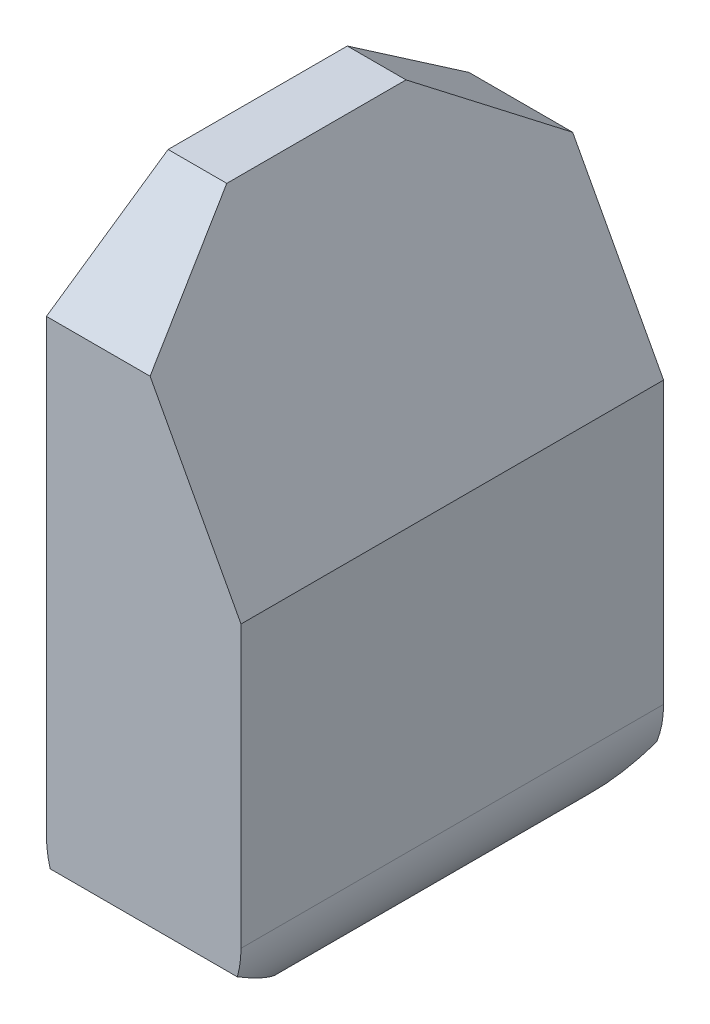
ISO-10303-21;
HEADER;
FILE_DESCRIPTION(('STEP AP214'),'2;1');
FILE_NAME('part.step','',(''),(''),'','','');
FILE_SCHEMA(('AUTOMOTIVE_DESIGN { 1 0 10303 214 1 1 1 1 }'));
ENDSEC;
DATA;
#1=APPLICATION_CONTEXT('core data for automotive mechanical design processes');
#2=APPLICATION_PROTOCOL_DEFINITION('international standard','automotive_design',2000,#1);
#3=PRODUCT_CONTEXT('',#1,'mechanical');
#4=PRODUCT('Part','Part','',(#3));
#5=PRODUCT_RELATED_PRODUCT_CATEGORY('part','',(#4));
#6=PRODUCT_DEFINITION_FORMATION('','',#4);
#7=PRODUCT_DEFINITION_CONTEXT('part definition',#1,'design');
#8=PRODUCT_DEFINITION('design','',#6,#7);
#9=PRODUCT_DEFINITION_SHAPE('','',#8);
#10=(LENGTH_UNIT() NAMED_UNIT(*) SI_UNIT(.MILLI.,.METRE.));
#11=(NAMED_UNIT(*) PLANE_ANGLE_UNIT() SI_UNIT($,.RADIAN.));
#12=(NAMED_UNIT(*) SI_UNIT($,.STERADIAN.) SOLID_ANGLE_UNIT());
#13=UNCERTAINTY_MEASURE_WITH_UNIT(LENGTH_MEASURE(1.E-05),#10,'distance_accuracy_value','');
#14=(GEOMETRIC_REPRESENTATION_CONTEXT(3) GLOBAL_UNCERTAINTY_ASSIGNED_CONTEXT((#13)) GLOBAL_UNIT_ASSIGNED_CONTEXT((#10,
#11,#12)) REPRESENTATION_CONTEXT('',''));
#15=CARTESIAN_POINT('',(0.,0.,0.));
#16=DIRECTION('',(0.,0.,1.));
#17=DIRECTION('',(1.,0.,0.));
#18=AXIS2_PLACEMENT_3D('',#15,#16,#17);
#19=CARTESIAN_POINT('',(0.976429971118131,36.195,-2.));
#20=DIRECTION('',(0.,1.,0.));
#21=DIRECTION('',(0.,0.,1.));
#22=AXIS2_PLACEMENT_3D('',#19,#20,#21);
#23=PLANE('',#22);
#24=DIRECTION('',(-1.,0.,0.));
#25=VECTOR('',#24,1.);
#26=CARTESIAN_POINT('',(11.5754000000001,36.195,21.4669162999131));
#27=LINE('',#26,#25);
#28=CARTESIAN_POINT('',(0.976429971118131,36.195,21.4669162999131));
#29=VERTEX_POINT('',#28);
#30=CARTESIAN_POINT('',(-3.6,36.195,21.4669162999131));
#31=VERTEX_POINT('',#30);
#32=EDGE_CURVE('E182',#29,#31,#27,.T.);
#33=ORIENTED_EDGE('',*,*,#32,.F.);
#34=DIRECTION('',(0.,0.,1.));
#35=VECTOR('',#34,1.);
#36=CARTESIAN_POINT('',(0.976429971118131,36.195,-2.));
#37=LINE('',#36,#35);
#38=CARTESIAN_POINT('',(0.976429971118131,36.195,7.48908370008694));
#39=VERTEX_POINT('',#38);
#40=EDGE_CURVE('E141',#39,#29,#37,.T.);
#41=ORIENTED_EDGE('',*,*,#40,.F.);
#42=DIRECTION('',(-1.,0.,0.));
#43=VECTOR('',#42,1.);
#44=CARTESIAN_POINT('',(11.5754000000001,36.195,7.48908370008694));
#45=LINE('',#44,#43);
#46=CARTESIAN_POINT('',(-3.6,36.195,7.48908370008694));
#47=VERTEX_POINT('',#46);
#48=EDGE_CURVE('E181',#39,#47,#45,.T.);
#49=ORIENTED_EDGE('',*,*,#48,.T.);
#50=DIRECTION('',(0.,0.,1.));
#51=VECTOR('',#50,1.);
#52=CARTESIAN_POINT('',(-3.6,36.195,-2.));
#53=LINE('',#52,#51);
#54=EDGE_CURVE('E140',#47,#31,#53,.T.);
#55=ORIENTED_EDGE('',*,*,#54,.T.);
#56=EDGE_LOOP('',(#33,#41,#49,#55));
#57=FACE_BOUND('',#56,.T.);
#58=ADVANCED_FACE('F34',(#57),#23,.T.);
#59=CARTESIAN_POINT('',(11.5754000000001,16.4753291186095,-2.));
#60=DIRECTION('',(0.88083097367117,0.473430877553945,0.));
#61=DIRECTION('',(-0.473430877553945,0.88083097367117,0.));
#62=AXIS2_PLACEMENT_3D('',#59,#60,#61);
#63=PLANE('',#62);
#64=DIRECTION('',(-0.291385375260063,0.542130384756359,-0.788155574114955));
#65=VECTOR('',#64,1.);
#66=CARTESIAN_POINT('',(-0.397907586558822,38.7519922590094,17.7495306698626));
#67=LINE('',#66,#65);
#68=CARTESIAN_POINT('',(4.48459549786564,29.6679629958018,30.956));
#69=VERTEX_POINT('',#68);
#70=EDGE_CURVE('E184',#69,#29,#67,.T.);
#71=ORIENTED_EDGE('',*,*,#70,.F.);
#72=DIRECTION('',(-0.473430877553945,0.88083097367117,0.));
#73=VECTOR('',#72,1.);
#74=CARTESIAN_POINT('',(11.5754000000001,16.4753291186095,30.956));
#75=LINE('',#74,#73);
#76=CARTESIAN_POINT('',(11.5754000000001,16.4753291186095,30.956));
#77=VERTEX_POINT('',#76);
#78=EDGE_CURVE('E121',#77,#69,#75,.T.);
#79=ORIENTED_EDGE('',*,*,#78,.F.);
#80=DIRECTION('',(0.,0.,1.));
#81=VECTOR('',#80,1.);
#82=CARTESIAN_POINT('',(11.5754000000001,16.4753291186095,-2.));
#83=LINE('',#82,#81);
#84=CARTESIAN_POINT('',(11.5754000000001,16.4753291186095,-2.));
#85=VERTEX_POINT('',#84);
#86=EDGE_CURVE('E145',#85,#77,#83,.T.);
#87=ORIENTED_EDGE('',*,*,#86,.F.);
#88=DIRECTION('',(-0.473430877553945,0.88083097367117,0.));
#89=VECTOR('',#88,1.);
#90=CARTESIAN_POINT('',(11.5754000000001,16.4753291186095,-2.));
#91=LINE('',#90,#89);
#92=CARTESIAN_POINT('',(4.48459549786565,29.6679629958017,-2.));
#93=VERTEX_POINT('',#92);
#94=EDGE_CURVE('E137',#85,#93,#91,.T.);
#95=ORIENTED_EDGE('',*,*,#94,.T.);
#96=DIRECTION('',(0.291385375260063,-0.542130384756359,-0.788155574114955));
#97=VECTOR('',#96,1.);
#98=CARTESIAN_POINT('',(7.17066876008549,24.6704509215209,-9.26544224194586));
#99=LINE('',#98,#97);
#100=EDGE_CURVE('E168',#39,#93,#99,.T.);
#101=ORIENTED_EDGE('',*,*,#100,.F.);
#102=ORIENTED_EDGE('',*,*,#40,.T.);
#103=EDGE_LOOP('',(#71,#79,#87,#95,#101,#102));
#104=FACE_BOUND('',#103,.T.);
#105=ADVANCED_FACE('F167',(#104),#63,.T.);
#106=CARTESIAN_POINT('',(11.5754000000001,-5.42736766661334,-2.));
#107=DIRECTION('',(1.,0.,0.));
#108=DIRECTION('',(0.,1.,0.));
#109=AXIS2_PLACEMENT_3D('',#106,#107,#108);
#110=PLANE('',#109);
#111=ORIENTED_EDGE('',*,*,#86,.T.);
#112=DIRECTION('',(0.,1.,0.));
#113=VECTOR('',#112,1.);
#114=CARTESIAN_POINT('',(11.5754000000001,-5.42736766661334,30.956));
#115=LINE('',#114,#113);
#116=CARTESIAN_POINT('',(11.5754000000001,-5.42736766661334,30.956));
#117=VERTEX_POINT('',#116);
#118=EDGE_CURVE('E118',#117,#77,#115,.T.);
#119=ORIENTED_EDGE('',*,*,#118,.F.);
#120=DIRECTION('',(0.,0.,1.));
#121=VECTOR('',#120,1.);
#122=CARTESIAN_POINT('',(11.5754000000001,-5.42736766661334,-2.));
#123=LINE('',#122,#121);
#124=CARTESIAN_POINT('',(11.5754000000001,-5.42736766661334,-2.));
#125=VERTEX_POINT('',#124);
#126=EDGE_CURVE('E147',#125,#117,#123,.T.);
#127=ORIENTED_EDGE('',*,*,#126,.F.);
#128=DIRECTION('',(0.,1.,0.));
#129=VECTOR('',#128,1.);
#130=CARTESIAN_POINT('',(11.5754000000001,-5.42736766661334,-2.));
#131=LINE('',#130,#129);
#132=EDGE_CURVE('E134',#125,#85,#131,.T.);
#133=ORIENTED_EDGE('',*,*,#132,.T.);
#134=EDGE_LOOP('',(#111,#119,#127,#133));
#135=FACE_BOUND('',#134,.T.);
#136=ADVANCED_FACE('F174',(#135),#110,.T.);
#137=CARTESIAN_POINT('',(3.98770000000007,-5.42736766661334,-2.));
#138=DIRECTION('',(0.,0.,1.));
#139=DIRECTION('',(1.,0.,0.));
#140=AXIS2_PLACEMENT_3D('',#137,#138,#139);
#141=CYLINDRICAL_SURFACE('',#140,7.58770000000007);
#142=CARTESIAN_POINT('',(3.98770000000007,-5.42736766661334,-5.51623241671642));
#143=DIRECTION('',(0.,0.786808555210681,0.617197130135325));
#144=DIRECTION('',(0.,-0.617197130135325,0.786808555210681));
#145=AXIS2_PLACEMENT_3D('',#142,#143,#144);
#146=ELLIPSE('',#145,12.2938031133366,7.58770000000007);
#147=CARTESIAN_POINT('',(11.056313108871,-8.18560986176215,-2.));
#148=VERTEX_POINT('',#147);
#149=CARTESIAN_POINT('',(-3.08091310887084,-8.18560986176215,-2.));
#150=VERTEX_POINT('',#149);
#151=EDGE_CURVE('E47',#148,#150,#146,.F.);
#152=ORIENTED_EDGE('',*,*,#151,.F.);
#153=CARTESIAN_POINT('',(3.98770000000007,-5.42736766661334,-2.));
#154=DIRECTION('',(0.,0.,1.));
#155=DIRECTION('',(1.,0.,0.));
#156=AXIS2_PLACEMENT_3D('',#153,#154,#155);
#157=CIRCLE('',#156,7.58770000000007);
#158=EDGE_CURVE('E130',#148,#125,#157,.T.);
#159=ORIENTED_EDGE('',*,*,#158,.T.);
#160=ORIENTED_EDGE('',*,*,#126,.T.);
#161=CARTESIAN_POINT('',(3.98770000000007,-5.42736766661334,30.956));
#162=DIRECTION('',(0.,0.,1.));
#163=DIRECTION('',(1.,0.,0.));
#164=AXIS2_PLACEMENT_3D('',#161,#162,#163);
#165=CIRCLE('',#164,7.58770000000007);
#166=CARTESIAN_POINT('',(11.2861695700358,-7.50234555210111,30.956));
#167=VERTEX_POINT('',#166);
#168=EDGE_CURVE('E111',#167,#117,#165,.T.);
#169=ORIENTED_EDGE('',*,*,#168,.F.);
#170=CARTESIAN_POINT('',(3.98770000000007,-5.42736766661334,34.0615038151931));
#171=DIRECTION('',(0.,0.831476219754838,-0.555560344141125));
#172=DIRECTION('',(0.,0.555560344141125,0.831476219754838));
#173=AXIS2_PLACEMENT_3D('',#170,#171,#172);
#174=ELLIPSE('',#173,13.6577422777185,7.58770000000007);
#175=CARTESIAN_POINT('',(-3.31076957003567,-7.50234555210111,30.956));
#176=VERTEX_POINT('',#175);
#177=EDGE_CURVE('E53',#176,#167,#174,.F.);
#178=ORIENTED_EDGE('',*,*,#177,.F.);
#179=CARTESIAN_POINT('',(-3.6,-5.42736766661334,30.956));
#180=VERTEX_POINT('',#179);
#181=EDGE_CURVE('E109',#180,#176,#165,.T.);
#182=ORIENTED_EDGE('',*,*,#181,.F.);
#183=DIRECTION('',(0.,0.,1.));
#184=VECTOR('',#183,1.);
#185=CARTESIAN_POINT('',(-3.6,-5.42736766661334,-2.));
#186=LINE('',#185,#184);
#187=CARTESIAN_POINT('',(-3.6,-5.42736766661334,-2.));
#188=VERTEX_POINT('',#187);
#189=EDGE_CURVE('E149',#188,#180,#186,.T.);
#190=ORIENTED_EDGE('',*,*,#189,.F.);
#191=EDGE_CURVE('E131',#188,#150,#157,.T.);
#192=ORIENTED_EDGE('',*,*,#191,.T.);
#193=EDGE_LOOP('',(#152,#159,#160,#169,#178,#182,#190,#192));
#194=FACE_BOUND('',#193,.T.);
#195=ADVANCED_FACE('F107',(#194),#141,.T.);
#196=CARTESIAN_POINT('',(-3.6,36.195,-2.));
#197=DIRECTION('',(-1.,0.,0.));
#198=DIRECTION('',(0.,0.,1.));
#199=AXIS2_PLACEMENT_3D('',#196,#197,#198);
#200=PLANE('',#199);
#201=DIRECTION('',(0.,-0.56672289929164,0.823908463009379));
#202=VECTOR('',#201,1.);
#203=CARTESIAN_POINT('',(-3.6,36.195,21.4669162999131));
#204=LINE('',#203,#202);
#205=CARTESIAN_POINT('',(-3.6,29.6679629958017,30.956));
#206=VERTEX_POINT('',#205);
#207=EDGE_CURVE('E177',#31,#206,#204,.T.);
#208=ORIENTED_EDGE('',*,*,#207,.F.);
#209=ORIENTED_EDGE('',*,*,#54,.F.);
#210=DIRECTION('',(0.,0.566722899291641,0.823908463009379));
#211=VECTOR('',#210,1.);
#212=CARTESIAN_POINT('',(-3.6,29.6679629958017,-2.));
#213=LINE('',#212,#211);
#214=CARTESIAN_POINT('',(-3.6,29.6679629958017,-2.));
#215=VERTEX_POINT('',#214);
#216=EDGE_CURVE('E175',#215,#47,#213,.T.);
#217=ORIENTED_EDGE('',*,*,#216,.F.);
#218=DIRECTION('',(0.,-1.,0.));
#219=VECTOR('',#218,1.);
#220=CARTESIAN_POINT('',(-3.6,36.195,-2.));
#221=LINE('',#220,#219);
#222=EDGE_CURVE('E128',#215,#188,#221,.T.);
#223=ORIENTED_EDGE('',*,*,#222,.T.);
#224=ORIENTED_EDGE('',*,*,#189,.T.);
#225=DIRECTION('',(0.,-1.,0.));
#226=VECTOR('',#225,1.);
#227=CARTESIAN_POINT('',(-3.6,36.195,30.956));
#228=LINE('',#227,#226);
#229=EDGE_CURVE('E116',#206,#180,#228,.T.);
#230=ORIENTED_EDGE('',*,*,#229,.F.);
#231=EDGE_LOOP('',(#208,#209,#217,#223,#224,#230));
#232=FACE_BOUND('',#231,.T.);
#233=ADVANCED_FACE('F193',(#232),#200,.T.);
#234=CARTESIAN_POINT('',(3.98770000000007,-5.42736766661334,-2.));
#235=DIRECTION('',(0.,0.,1.));
#236=DIRECTION('',(1.,0.,0.));
#237=AXIS2_PLACEMENT_3D('',#234,#235,#236);
#238=PLANE('',#237);
#239=ORIENTED_EDGE('',*,*,#158,.F.);
#240=DIRECTION('',(-1.,0.,0.));
#241=VECTOR('',#240,1.);
#242=CARTESIAN_POINT('',(3.98770000000007,-8.18560986176215,-2.));
#243=LINE('',#242,#241);
#244=EDGE_CURVE('E11',#148,#150,#243,.T.);
#245=ORIENTED_EDGE('',*,*,#244,.T.);
#246=ORIENTED_EDGE('',*,*,#191,.F.);
#247=ORIENTED_EDGE('',*,*,#222,.F.);
#248=DIRECTION('',(1.,0.,0.));
#249=VECTOR('',#248,1.);
#250=CARTESIAN_POINT('',(3.98770000000007,29.6679629958017,-2.));
#251=LINE('',#250,#249);
#252=EDGE_CURVE('E104',#215,#93,#251,.T.);
#253=ORIENTED_EDGE('',*,*,#252,.T.);
#254=ORIENTED_EDGE('',*,*,#94,.F.);
#255=ORIENTED_EDGE('',*,*,#132,.F.);
#256=EDGE_LOOP('',(#239,#245,#246,#247,#253,#254,#255));
#257=FACE_BOUND('',#256,.T.);
#258=ADVANCED_FACE('F159',(#257),#238,.F.);
#259=CARTESIAN_POINT('',(3.98770000000007,-5.42736766661334,30.956));
#260=DIRECTION('',(0.,0.,1.));
#261=DIRECTION('',(1.,0.,0.));
#262=AXIS2_PLACEMENT_3D('',#259,#260,#261);
#263=PLANE('',#262);
#264=DIRECTION('',(-1.,0.,0.));
#265=VECTOR('',#264,1.);
#266=CARTESIAN_POINT('',(3.98770000000007,-7.50234555210112,30.956));
#267=LINE('',#266,#265);
#268=EDGE_CURVE('E41',#167,#176,#267,.T.);
#269=ORIENTED_EDGE('',*,*,#268,.F.);
#270=ORIENTED_EDGE('',*,*,#168,.T.);
#271=ORIENTED_EDGE('',*,*,#118,.T.);
#272=ORIENTED_EDGE('',*,*,#78,.T.);
#273=DIRECTION('',(1.,0.,0.));
#274=VECTOR('',#273,1.);
#275=CARTESIAN_POINT('',(3.98770000000007,29.6679629958018,30.956));
#276=LINE('',#275,#274);
#277=EDGE_CURVE('E144',#206,#69,#276,.T.);
#278=ORIENTED_EDGE('',*,*,#277,.F.);
#279=ORIENTED_EDGE('',*,*,#229,.T.);
#280=ORIENTED_EDGE('',*,*,#181,.T.);
#281=EDGE_LOOP('',(#269,#270,#271,#272,#278,#279,#280));
#282=FACE_BOUND('',#281,.T.);
#283=ADVANCED_FACE('F113',(#282),#263,.T.);
#284=CARTESIAN_POINT('',(11.5754000000001,36.195,21.4669162999131));
#285=DIRECTION('',(0.,-0.823908463009379,-0.56672289929164));
#286=DIRECTION('',(0.,0.56672289929164,-0.823908463009379));
#287=AXIS2_PLACEMENT_3D('',#284,#285,#286);
#288=PLANE('',#287);
#289=ORIENTED_EDGE('',*,*,#70,.T.);
#290=ORIENTED_EDGE('',*,*,#32,.T.);
#291=ORIENTED_EDGE('',*,*,#207,.T.);
#292=ORIENTED_EDGE('',*,*,#277,.T.);
#293=EDGE_LOOP('',(#289,#290,#291,#292));
#294=FACE_BOUND('',#293,.T.);
#295=ADVANCED_FACE('F195',(#294),#288,.F.);
#296=CARTESIAN_POINT('',(11.5754000000001,29.6679629958017,-2.));
#297=DIRECTION('',(0.,-0.823908463009379,0.566722899291641));
#298=DIRECTION('',(0.,-0.566722899291641,-0.823908463009379));
#299=AXIS2_PLACEMENT_3D('',#296,#297,#298);
#300=PLANE('',#299);
#301=ORIENTED_EDGE('',*,*,#100,.T.);
#302=ORIENTED_EDGE('',*,*,#252,.F.);
#303=ORIENTED_EDGE('',*,*,#216,.T.);
#304=ORIENTED_EDGE('',*,*,#48,.F.);
#305=EDGE_LOOP('',(#301,#302,#303,#304));
#306=FACE_BOUND('',#305,.T.);
#307=ADVANCED_FACE('F187',(#306),#300,.F.);
#308=CARTESIAN_POINT('',(11.5754000000001,-17.0179978876175,16.7144532159722));
#309=DIRECTION('',(0.,0.831476219754838,-0.555560344141125));
#310=DIRECTION('',(0.,0.555560344141125,0.831476219754838));
#311=AXIS2_PLACEMENT_3D('',#308,#309,#310);
#312=PLANE('',#311);
#313=ORIENTED_EDGE('',*,*,#177,.T.);
#314=ORIENTED_EDGE('',*,*,#268,.T.);
#315=EDGE_LOOP('',(#313,#314));
#316=FACE_BOUND('',#315,.T.);
#317=ADVANCED_FACE('F100',(#316),#312,.F.);
#318=CARTESIAN_POINT('',(11.5754000000001,-4.81069075043599,-6.30237779840816));
#319=DIRECTION('',(0.,0.786808555210681,0.617197130135325));
#320=DIRECTION('',(0.,-0.617197130135325,0.786808555210681));
#321=AXIS2_PLACEMENT_3D('',#318,#319,#320);
#322=PLANE('',#321);
#323=ORIENTED_EDGE('',*,*,#151,.T.);
#324=ORIENTED_EDGE('',*,*,#244,.F.);
#325=EDGE_LOOP('',(#323,#324));
#326=FACE_BOUND('',#325,.T.);
#327=ADVANCED_FACE('F246',(#326),#322,.F.);
#328=CLOSED_SHELL('',(#58,#105,#136,#195,#233,#258,#283,#295,#307,#317,#327));
#329=MANIFOLD_SOLID_BREP('B2',#328);
#330=ADVANCED_BREP_SHAPE_REPRESENTATION('',(#18,#329),#14);
#331=SHAPE_DEFINITION_REPRESENTATION(#9,#330);
ENDSEC;
END-ISO-10303-21;
